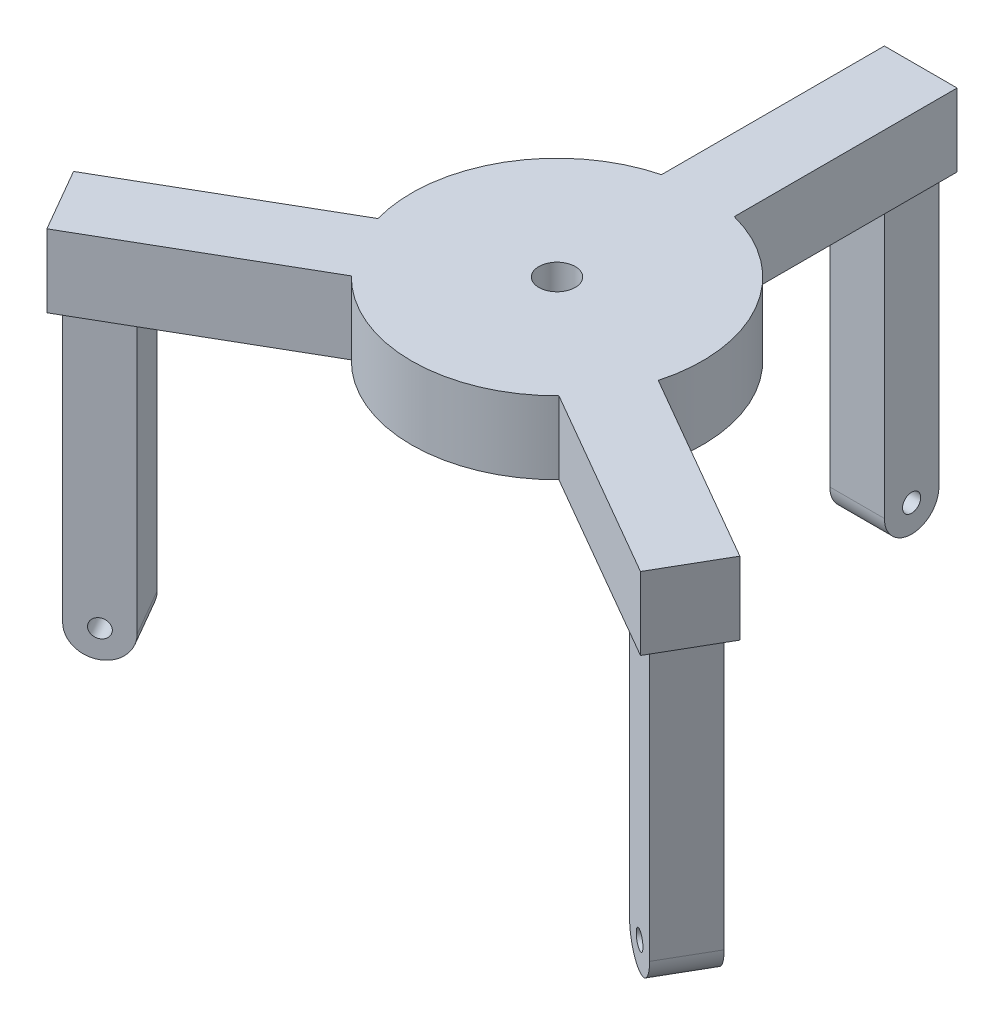
ISO-10303-21;
HEADER;
FILE_DESCRIPTION(('STEP AP214'),'2;1');
FILE_NAME('part.step','',(''),(''),'','','');
FILE_SCHEMA(('AUTOMOTIVE_DESIGN { 1 0 10303 214 1 1 1 1 }'));
ENDSEC;
DATA;
#1=APPLICATION_CONTEXT('core data for automotive mechanical design processes');
#2=APPLICATION_PROTOCOL_DEFINITION('international standard','automotive_design',2000,#1);
#3=PRODUCT_CONTEXT('',#1,'mechanical');
#4=PRODUCT('Part','Part','',(#3));
#5=PRODUCT_RELATED_PRODUCT_CATEGORY('part','',(#4));
#6=PRODUCT_DEFINITION_FORMATION('','',#4);
#7=PRODUCT_DEFINITION_CONTEXT('part definition',#1,'design');
#8=PRODUCT_DEFINITION('design','',#6,#7);
#9=PRODUCT_DEFINITION_SHAPE('','',#8);
#10=(LENGTH_UNIT() NAMED_UNIT(*) SI_UNIT(.MILLI.,.METRE.));
#11=(NAMED_UNIT(*) PLANE_ANGLE_UNIT() SI_UNIT($,.RADIAN.));
#12=(NAMED_UNIT(*) SI_UNIT($,.STERADIAN.) SOLID_ANGLE_UNIT());
#13=UNCERTAINTY_MEASURE_WITH_UNIT(LENGTH_MEASURE(1.E-05),#10,'distance_accuracy_value','');
#14=(GEOMETRIC_REPRESENTATION_CONTEXT(3) GLOBAL_UNCERTAINTY_ASSIGNED_CONTEXT((#13)) GLOBAL_UNIT_ASSIGNED_CONTEXT((#10,
#11,#12)) REPRESENTATION_CONTEXT('',''));
#15=CARTESIAN_POINT('',(0.,0.,0.));
#16=DIRECTION('',(0.,0.,1.));
#17=DIRECTION('',(1.,0.,0.));
#18=AXIS2_PLACEMENT_3D('',#15,#16,#17);
#19=CARTESIAN_POINT('',(0.,0.,0.));
#20=DIRECTION('',(0.,1.,0.));
#21=DIRECTION('',(0.,0.,1.));
#22=AXIS2_PLACEMENT_3D('',#19,#20,#21);
#23=PLANE('',#22);
#24=CARTESIAN_POINT('',(0.,0.,0.));
#25=DIRECTION('',(0.,1.,0.));
#26=DIRECTION('',(0.,0.,1.));
#27=AXIS2_PLACEMENT_3D('',#24,#25,#26);
#28=CIRCLE('',#27,10.);
#29=CARTESIAN_POINT('',(0.,0.,10.));
#30=VERTEX_POINT('',#29);
#31=EDGE_CURVE('E221',#30,#30,#28,.T.);
#32=ORIENTED_EDGE('',*,*,#31,.T.);
#33=EDGE_LOOP('',(#32));
#34=FACE_BOUND('',#33,.T.);
#35=DIRECTION('',(0.866025403784436,0.,0.500000000000004));
#36=VECTOR('',#35,1.);
#37=CARTESIAN_POINT('',(176.374953737965,0.,84.5096189432343));
#38=LINE('',#37,#36);
#39=CARTESIAN_POINT('',(150.394191624432,0.,69.5096189432342));
#40=VERTEX_POINT('',#39);
#41=CARTESIAN_POINT('',(176.374953737965,0.,84.5096189432343));
#42=VERTEX_POINT('',#41);
#43=EDGE_CURVE('E246',#40,#42,#38,.T.);
#44=ORIENTED_EDGE('',*,*,#43,.F.);
#45=DIRECTION('',(0.500000000000004,0.,-0.866025403784436));
#46=VECTOR('',#45,1.);
#47=CARTESIAN_POINT('',(135.394191624432,0.,95.4903810567672));
#48=LINE('',#47,#46);
#49=CARTESIAN_POINT('',(135.394191624432,0.,95.4903810567672));
#50=VERTEX_POINT('',#49);
#51=EDGE_CURVE('E251',#50,#40,#48,.T.);
#52=ORIENTED_EDGE('',*,*,#51,.F.);
#53=DIRECTION('',(-0.866025403784436,0.,-0.500000000000004));
#54=VECTOR('',#53,1.);
#55=CARTESIAN_POINT('',(161.374953737965,0.,110.490381056767));
#56=LINE('',#55,#54);
#57=CARTESIAN_POINT('',(161.374953737965,0.,110.490381056767));
#58=VERTEX_POINT('',#57);
#59=EDGE_CURVE('E260',#58,#50,#56,.T.);
#60=ORIENTED_EDGE('',*,*,#59,.F.);
#61=DIRECTION('',(-0.500000000000004,0.,0.866025403784436));
#62=VECTOR('',#61,1.);
#63=CARTESIAN_POINT('',(161.374953737965,0.,110.490381056767));
#64=LINE('',#63,#62);
#65=EDGE_CURVE('E257',#42,#58,#64,.T.);
#66=ORIENTED_EDGE('',*,*,#65,.F.);
#67=EDGE_LOOP('',(#44,#52,#60,#66));
#68=FACE_BOUND('',#67,.T.);
#69=CARTESIAN_POINT('',(0.,0.,0.));
#70=DIRECTION('',(0.,1.,0.));
#71=DIRECTION('',(0.,0.,1.));
#72=AXIS2_PLACEMENT_3D('',#69,#70,#71);
#73=CIRCLE('',#72,80.);
#74=CARTESIAN_POINT('',(-57.0820393249942,0.,56.0503415377624));
#75=VERTEX_POINT('',#74);
#76=CARTESIAN_POINT('',(57.0820393249934,0.,56.0503415377632));
#77=VERTEX_POINT('',#76);
#78=EDGE_CURVE('E318',#75,#77,#73,.T.);
#79=ORIENTED_EDGE('',*,*,#78,.F.);
#80=DIRECTION('',(0.866025403784443,0.,-0.499999999999992));
#81=VECTOR('',#80,1.);
#82=CARTESIAN_POINT('',(9.99999999999983,0.,17.3205080756888));
#83=LINE('',#82,#81);
#84=CARTESIAN_POINT('',(-163.205080756889,0.,117.320508075687));
#85=VERTEX_POINT('',#84);
#86=EDGE_CURVE('E322',#85,#75,#83,.T.);
#87=ORIENTED_EDGE('',*,*,#86,.F.);
#88=DIRECTION('',(0.499999999999992,0.,0.866025403784443));
#89=VECTOR('',#88,1.);
#90=CARTESIAN_POINT('',(-173.205080756889,0.,99.9999999999984));
#91=LINE('',#90,#89);
#92=CARTESIAN_POINT('',(-183.205080756889,0.,82.6794919243095));
#93=VERTEX_POINT('',#92);
#94=EDGE_CURVE('E367',#93,#85,#91,.T.);
#95=ORIENTED_EDGE('',*,*,#94,.F.);
#96=DIRECTION('',(0.866025403784443,0.,-0.499999999999992));
#97=VECTOR('',#96,1.);
#98=CARTESIAN_POINT('',(-9.99999999999983,0.,-17.3205080756889));
#99=LINE('',#98,#97);
#100=CARTESIAN_POINT('',(-77.0820393249939,0.,21.4093253863847));
#101=VERTEX_POINT('',#100);
#102=EDGE_CURVE('E364',#93,#101,#99,.T.);
#103=ORIENTED_EDGE('',*,*,#102,.T.);
#104=CARTESIAN_POINT('',(-20.,0.,-77.4596669241483));
#105=VERTEX_POINT('',#104);
#106=EDGE_CURVE('E349',#105,#101,#73,.T.);
#107=ORIENTED_EDGE('',*,*,#106,.F.);
#108=DIRECTION('',(0.,0.,1.));
#109=VECTOR('',#108,1.);
#110=CARTESIAN_POINT('',(-20.,0.,0.));
#111=LINE('',#110,#109);
#112=CARTESIAN_POINT('',(-20.,0.,-200.));
#113=VERTEX_POINT('',#112);
#114=EDGE_CURVE('E362',#113,#105,#111,.T.);
#115=ORIENTED_EDGE('',*,*,#114,.F.);
#116=DIRECTION('',(-1.,0.,0.));
#117=VECTOR('',#116,1.);
#118=CARTESIAN_POINT('',(0.,0.,-200.));
#119=LINE('',#118,#117);
#120=CARTESIAN_POINT('',(20.,0.,-200.));
#121=VERTEX_POINT('',#120);
#122=EDGE_CURVE('E360',#121,#113,#119,.T.);
#123=ORIENTED_EDGE('',*,*,#122,.F.);
#124=DIRECTION('',(0.,0.,1.));
#125=VECTOR('',#124,1.);
#126=CARTESIAN_POINT('',(20.,0.,0.));
#127=LINE('',#126,#125);
#128=CARTESIAN_POINT('',(20.,0.,-77.4596669241483));
#129=VERTEX_POINT('',#128);
#130=EDGE_CURVE('E357',#121,#129,#127,.T.);
#131=ORIENTED_EDGE('',*,*,#130,.T.);
#132=CARTESIAN_POINT('',(77.0820393249936,0.,21.4093253863857));
#133=VERTEX_POINT('',#132);
#134=EDGE_CURVE('E350',#133,#129,#73,.T.);
#135=ORIENTED_EDGE('',*,*,#134,.F.);
#136=DIRECTION('',(-0.866025403784436,0.,-0.500000000000004));
#137=VECTOR('',#136,1.);
#138=CARTESIAN_POINT('',(10.0000000000001,0.,-17.3205080756887));
#139=LINE('',#138,#137);
#140=CARTESIAN_POINT('',(183.205080756887,0.,82.6794919243121));
#141=VERTEX_POINT('',#140);
#142=EDGE_CURVE('E355',#141,#133,#139,.T.);
#143=ORIENTED_EDGE('',*,*,#142,.F.);
#144=DIRECTION('',(0.500000000000004,0.,-0.866025403784436));
#145=VECTOR('',#144,1.);
#146=CARTESIAN_POINT('',(173.205080756887,0.,100.000000000001));
#147=LINE('',#146,#145);
#148=CARTESIAN_POINT('',(163.205080756887,0.,117.32050807569));
#149=VERTEX_POINT('',#148);
#150=EDGE_CURVE('E353',#149,#141,#147,.T.);
#151=ORIENTED_EDGE('',*,*,#150,.F.);
#152=DIRECTION('',(-0.866025403784436,0.,-0.500000000000004));
#153=VECTOR('',#152,1.);
#154=CARTESIAN_POINT('',(-10.0000000000001,0.,17.3205080756887));
#155=LINE('',#154,#153);
#156=EDGE_CURVE('E348',#149,#77,#155,.T.);
#157=ORIENTED_EDGE('',*,*,#156,.T.);
#158=EDGE_LOOP('',(#79,#87,#95,#103,#107,#115,#123,#131,#135,#143,#151,#157));
#159=FACE_BOUND('',#158,.T.);
#160=DIRECTION('',(0.,0.,-1.));
#161=VECTOR('',#160,1.);
#162=CARTESIAN_POINT('',(-15.,0.,-195.));
#163=LINE('',#162,#161);
#164=CARTESIAN_POINT('',(-15.,0.,-165.));
#165=VERTEX_POINT('',#164);
#166=CARTESIAN_POINT('',(-15.,0.,-195.));
#167=VERTEX_POINT('',#166);
#168=EDGE_CURVE('E286',#165,#167,#163,.T.);
#169=ORIENTED_EDGE('',*,*,#168,.F.);
#170=DIRECTION('',(-1.,0.,0.));
#171=VECTOR('',#170,1.);
#172=CARTESIAN_POINT('',(15.,0.,-165.));
#173=LINE('',#172,#171);
#174=CARTESIAN_POINT('',(15.,0.,-165.));
#175=VERTEX_POINT('',#174);
#176=EDGE_CURVE('E293',#175,#165,#173,.T.);
#177=ORIENTED_EDGE('',*,*,#176,.F.);
#178=DIRECTION('',(0.,0.,1.));
#179=VECTOR('',#178,1.);
#180=CARTESIAN_POINT('',(15.,0.,-195.));
#181=LINE('',#180,#179);
#182=CARTESIAN_POINT('',(15.,0.,-195.));
#183=VERTEX_POINT('',#182);
#184=EDGE_CURVE('E302',#183,#175,#181,.T.);
#185=ORIENTED_EDGE('',*,*,#184,.F.);
#186=DIRECTION('',(1.,0.,0.));
#187=VECTOR('',#186,1.);
#188=CARTESIAN_POINT('',(15.,0.,-195.));
#189=LINE('',#188,#187);
#190=EDGE_CURVE('E299',#167,#183,#189,.T.);
#191=ORIENTED_EDGE('',*,*,#190,.F.);
#192=EDGE_LOOP('',(#169,#177,#185,#191));
#193=FACE_BOUND('',#192,.T.);
#194=DIRECTION('',(-0.866025403784443,0.,0.499999999999992));
#195=VECTOR('',#194,1.);
#196=CARTESIAN_POINT('',(-161.374953737967,0.,110.490381056765));
#197=LINE('',#196,#195);
#198=CARTESIAN_POINT('',(-135.394191624433,0.,95.4903810567653));
#199=VERTEX_POINT('',#198);
#200=CARTESIAN_POINT('',(-161.374953737967,0.,110.490381056765));
#201=VERTEX_POINT('',#200);
#202=EDGE_CURVE('E232',#199,#201,#197,.T.);
#203=ORIENTED_EDGE('',*,*,#202,.F.);
#204=DIRECTION('',(0.499999999999992,0.,0.866025403784443));
#205=VECTOR('',#204,1.);
#206=CARTESIAN_POINT('',(-150.394191624433,0.,69.509618943232));
#207=LINE('',#206,#205);
#208=CARTESIAN_POINT('',(-150.394191624433,0.,69.509618943232));
#209=VERTEX_POINT('',#208);
#210=EDGE_CURVE('E235',#209,#199,#207,.T.);
#211=ORIENTED_EDGE('',*,*,#210,.F.);
#212=DIRECTION('',(0.866025403784443,0.,-0.499999999999992));
#213=VECTOR('',#212,1.);
#214=CARTESIAN_POINT('',(-176.374953737966,0.,84.5096189432318));
#215=LINE('',#214,#213);
#216=CARTESIAN_POINT('',(-176.374953737966,0.,84.5096189432318));
#217=VERTEX_POINT('',#216);
#218=EDGE_CURVE('E60',#217,#209,#215,.T.);
#219=ORIENTED_EDGE('',*,*,#218,.F.);
#220=DIRECTION('',(-0.499999999999992,0.,-0.866025403784443));
#221=VECTOR('',#220,1.);
#222=CARTESIAN_POINT('',(-176.374953737966,0.,84.5096189432318));
#223=LINE('',#222,#221);
#224=EDGE_CURVE('E55',#201,#217,#223,.T.);
#225=ORIENTED_EDGE('',*,*,#224,.F.);
#226=EDGE_LOOP('',(#203,#211,#219,#225));
#227=FACE_BOUND('',#226,.T.);
#228=ADVANCED_FACE('F40',(#34,#68,#159,#193,#227),#23,.F.);
#229=CARTESIAN_POINT('',(0.,40.,0.));
#230=DIRECTION('',(0.,-1.,0.));
#231=DIRECTION('',(0.,0.,-1.));
#232=AXIS2_PLACEMENT_3D('',#229,#230,#231);
#233=CYLINDRICAL_SURFACE('',#232,80.);
#234=ORIENTED_EDGE('',*,*,#78,.T.);
#235=DIRECTION('',(0.,-1.,0.));
#236=VECTOR('',#235,1.);
#237=CARTESIAN_POINT('',(57.0820393249934,40.,56.0503415377632));
#238=LINE('',#237,#236);
#239=CARTESIAN_POINT('',(57.0820393249934,40.,56.0503415377632));
#240=VERTEX_POINT('',#239);
#241=EDGE_CURVE('E11',#240,#77,#238,.T.);
#242=ORIENTED_EDGE('',*,*,#241,.F.);
#243=CARTESIAN_POINT('',(0.,40.,0.));
#244=DIRECTION('',(0.,1.,0.));
#245=DIRECTION('',(0.,0.,1.));
#246=AXIS2_PLACEMENT_3D('',#243,#244,#245);
#247=CIRCLE('',#246,80.);
#248=CARTESIAN_POINT('',(-57.0820393249942,40.,56.0503415377624));
#249=VERTEX_POINT('',#248);
#250=EDGE_CURVE('E319',#249,#240,#247,.T.);
#251=ORIENTED_EDGE('',*,*,#250,.F.);
#252=DIRECTION('',(0.,-1.,0.));
#253=VECTOR('',#252,1.);
#254=CARTESIAN_POINT('',(-57.0820393249942,40.,56.0503415377624));
#255=LINE('',#254,#253);
#256=EDGE_CURVE('E345',#249,#75,#255,.T.);
#257=ORIENTED_EDGE('',*,*,#256,.T.);
#258=EDGE_LOOP('',(#234,#242,#251,#257));
#259=FACE_BOUND('',#258,.T.);
#260=ADVANCED_FACE('F410',(#259),#233,.T.);
#261=CARTESIAN_POINT('',(-10.0000000000001,40.,17.3205080756887));
#262=DIRECTION('',(-0.500000000000004,0.,0.866025403784436));
#263=DIRECTION('',(0.866025403784436,0.,0.500000000000004));
#264=AXIS2_PLACEMENT_3D('',#261,#262,#263);
#265=PLANE('',#264);
#266=ORIENTED_EDGE('',*,*,#156,.F.);
#267=DIRECTION('',(0.,-1.,0.));
#268=VECTOR('',#267,1.);
#269=CARTESIAN_POINT('',(163.205080756887,40.,117.32050807569));
#270=LINE('',#269,#268);
#271=CARTESIAN_POINT('',(163.205080756887,40.,117.32050807569));
#272=VERTEX_POINT('',#271);
#273=EDGE_CURVE('E48',#272,#149,#270,.T.);
#274=ORIENTED_EDGE('',*,*,#273,.F.);
#275=DIRECTION('',(-0.866025403784436,0.,-0.500000000000004));
#276=VECTOR('',#275,1.);
#277=CARTESIAN_POINT('',(-10.0000000000001,40.,17.3205080756887));
#278=LINE('',#277,#276);
#279=EDGE_CURVE('E321',#272,#240,#278,.T.);
#280=ORIENTED_EDGE('',*,*,#279,.T.);
#281=ORIENTED_EDGE('',*,*,#241,.T.);
#282=EDGE_LOOP('',(#266,#274,#280,#281));
#283=FACE_BOUND('',#282,.T.);
#284=ADVANCED_FACE('F42',(#283),#265,.T.);
#285=CARTESIAN_POINT('',(173.205080756887,40.,100.000000000001));
#286=DIRECTION('',(-0.866025403784436,0.,-0.500000000000004));
#287=DIRECTION('',(-0.500000000000004,0.,0.866025403784436));
#288=AXIS2_PLACEMENT_3D('',#285,#286,#287);
#289=PLANE('',#288);
#290=ORIENTED_EDGE('',*,*,#150,.T.);
#291=DIRECTION('',(0.,-1.,0.));
#292=VECTOR('',#291,1.);
#293=CARTESIAN_POINT('',(183.205080756887,40.,82.6794919243121));
#294=LINE('',#293,#292);
#295=CARTESIAN_POINT('',(183.205080756887,40.,82.6794919243121));
#296=VERTEX_POINT('',#295);
#297=EDGE_CURVE('E392',#296,#141,#294,.T.);
#298=ORIENTED_EDGE('',*,*,#297,.F.);
#299=DIRECTION('',(0.500000000000004,0.,-0.866025403784436));
#300=VECTOR('',#299,1.);
#301=CARTESIAN_POINT('',(173.205080756887,40.,100.000000000001));
#302=LINE('',#301,#300);
#303=EDGE_CURVE('E327',#272,#296,#302,.T.);
#304=ORIENTED_EDGE('',*,*,#303,.F.);
#305=ORIENTED_EDGE('',*,*,#273,.T.);
#306=EDGE_LOOP('',(#290,#298,#304,#305));
#307=FACE_BOUND('',#306,.T.);
#308=ADVANCED_FACE('F397',(#307),#289,.F.);
#309=CARTESIAN_POINT('',(10.0000000000001,40.,-17.3205080756887));
#310=DIRECTION('',(-0.500000000000004,0.,0.866025403784437));
#311=DIRECTION('',(0.866025403784437,0.,0.500000000000004));
#312=AXIS2_PLACEMENT_3D('',#309,#310,#311);
#313=PLANE('',#312);
#314=ORIENTED_EDGE('',*,*,#142,.T.);
#315=DIRECTION('',(0.,-1.,0.));
#316=VECTOR('',#315,1.);
#317=CARTESIAN_POINT('',(77.0820393249936,40.,21.4093253863857));
#318=LINE('',#317,#316);
#319=CARTESIAN_POINT('',(77.0820393249936,40.,21.4093253863857));
#320=VERTEX_POINT('',#319);
#321=EDGE_CURVE('E389',#320,#133,#318,.T.);
#322=ORIENTED_EDGE('',*,*,#321,.F.);
#323=DIRECTION('',(-0.866025403784436,0.,-0.500000000000004));
#324=VECTOR('',#323,1.);
#325=CARTESIAN_POINT('',(10.0000000000001,40.,-17.3205080756887));
#326=LINE('',#325,#324);
#327=EDGE_CURVE('E329',#296,#320,#326,.T.);
#328=ORIENTED_EDGE('',*,*,#327,.F.);
#329=ORIENTED_EDGE('',*,*,#297,.T.);
#330=EDGE_LOOP('',(#314,#322,#328,#329));
#331=FACE_BOUND('',#330,.T.);
#332=ADVANCED_FACE('F463',(#331),#313,.F.);
#333=ORIENTED_EDGE('',*,*,#134,.T.);
#334=DIRECTION('',(0.,-1.,0.));
#335=VECTOR('',#334,1.);
#336=CARTESIAN_POINT('',(20.,40.,-77.4596669241483));
#337=LINE('',#336,#335);
#338=CARTESIAN_POINT('',(20.,40.,-77.4596669241483));
#339=VERTEX_POINT('',#338);
#340=EDGE_CURVE('E387',#339,#129,#337,.T.);
#341=ORIENTED_EDGE('',*,*,#340,.F.);
#342=EDGE_CURVE('E324',#320,#339,#247,.T.);
#343=ORIENTED_EDGE('',*,*,#342,.F.);
#344=ORIENTED_EDGE('',*,*,#321,.T.);
#345=EDGE_LOOP('',(#333,#341,#343,#344));
#346=FACE_BOUND('',#345,.T.);
#347=ADVANCED_FACE('F434',(#346),#233,.T.);
#348=CARTESIAN_POINT('',(20.,40.,0.));
#349=DIRECTION('',(1.,0.,0.));
#350=DIRECTION('',(0.,0.,-1.));
#351=AXIS2_PLACEMENT_3D('',#348,#349,#350);
#352=PLANE('',#351);
#353=ORIENTED_EDGE('',*,*,#130,.F.);
#354=DIRECTION('',(0.,-1.,0.));
#355=VECTOR('',#354,1.);
#356=CARTESIAN_POINT('',(20.,40.,-200.));
#357=LINE('',#356,#355);
#358=CARTESIAN_POINT('',(20.,40.,-200.));
#359=VERTEX_POINT('',#358);
#360=EDGE_CURVE('E385',#359,#121,#357,.T.);
#361=ORIENTED_EDGE('',*,*,#360,.F.);
#362=DIRECTION('',(0.,0.,1.));
#363=VECTOR('',#362,1.);
#364=CARTESIAN_POINT('',(20.,40.,0.));
#365=LINE('',#364,#363);
#366=EDGE_CURVE('E331',#359,#339,#365,.T.);
#367=ORIENTED_EDGE('',*,*,#366,.T.);
#368=ORIENTED_EDGE('',*,*,#340,.T.);
#369=EDGE_LOOP('',(#353,#361,#367,#368));
#370=FACE_BOUND('',#369,.T.);
#371=ADVANCED_FACE('F439',(#370),#352,.T.);
#372=CARTESIAN_POINT('',(0.,40.,-200.));
#373=DIRECTION('',(0.,0.,1.));
#374=DIRECTION('',(1.,0.,0.));
#375=AXIS2_PLACEMENT_3D('',#372,#373,#374);
#376=PLANE('',#375);
#377=ORIENTED_EDGE('',*,*,#122,.T.);
#378=DIRECTION('',(0.,-1.,0.));
#379=VECTOR('',#378,1.);
#380=CARTESIAN_POINT('',(-20.,40.,-200.));
#381=LINE('',#380,#379);
#382=CARTESIAN_POINT('',(-20.,40.,-200.));
#383=VERTEX_POINT('',#382);
#384=EDGE_CURVE('E382',#383,#113,#381,.T.);
#385=ORIENTED_EDGE('',*,*,#384,.F.);
#386=DIRECTION('',(-1.,0.,0.));
#387=VECTOR('',#386,1.);
#388=CARTESIAN_POINT('',(0.,40.,-200.));
#389=LINE('',#388,#387);
#390=EDGE_CURVE('E334',#359,#383,#389,.T.);
#391=ORIENTED_EDGE('',*,*,#390,.F.);
#392=ORIENTED_EDGE('',*,*,#360,.T.);
#393=EDGE_LOOP('',(#377,#385,#391,#392));
#394=FACE_BOUND('',#393,.T.);
#395=ADVANCED_FACE('F458',(#394),#376,.F.);
#396=CARTESIAN_POINT('',(-20.,40.,0.));
#397=DIRECTION('',(1.,0.,0.));
#398=DIRECTION('',(0.,0.,-1.));
#399=AXIS2_PLACEMENT_3D('',#396,#397,#398);
#400=PLANE('',#399);
#401=ORIENTED_EDGE('',*,*,#114,.T.);
#402=DIRECTION('',(0.,-1.,0.));
#403=VECTOR('',#402,1.);
#404=CARTESIAN_POINT('',(-20.,40.,-77.4596669241483));
#405=LINE('',#404,#403);
#406=CARTESIAN_POINT('',(-20.,40.,-77.4596669241483));
#407=VERTEX_POINT('',#406);
#408=EDGE_CURVE('E379',#407,#105,#405,.T.);
#409=ORIENTED_EDGE('',*,*,#408,.F.);
#410=DIRECTION('',(0.,0.,1.));
#411=VECTOR('',#410,1.);
#412=CARTESIAN_POINT('',(-20.,40.,0.));
#413=LINE('',#412,#411);
#414=EDGE_CURVE('E336',#383,#407,#413,.T.);
#415=ORIENTED_EDGE('',*,*,#414,.F.);
#416=ORIENTED_EDGE('',*,*,#384,.T.);
#417=EDGE_LOOP('',(#401,#409,#415,#416));
#418=FACE_BOUND('',#417,.T.);
#419=ADVANCED_FACE('F451',(#418),#400,.F.);
#420=ORIENTED_EDGE('',*,*,#106,.T.);
#421=DIRECTION('',(0.,-1.,0.));
#422=VECTOR('',#421,1.);
#423=CARTESIAN_POINT('',(-77.0820393249939,40.,21.4093253863847));
#424=LINE('',#423,#422);
#425=CARTESIAN_POINT('',(-77.0820393249939,40.,21.4093253863847));
#426=VERTEX_POINT('',#425);
#427=EDGE_CURVE('E377',#426,#101,#424,.T.);
#428=ORIENTED_EDGE('',*,*,#427,.F.);
#429=EDGE_CURVE('E323',#407,#426,#247,.T.);
#430=ORIENTED_EDGE('',*,*,#429,.F.);
#431=ORIENTED_EDGE('',*,*,#408,.T.);
#432=EDGE_LOOP('',(#420,#428,#430,#431));
#433=FACE_BOUND('',#432,.T.);
#434=ADVANCED_FACE('F449',(#433),#233,.T.);
#435=CARTESIAN_POINT('',(-9.99999999999983,40.,-17.3205080756889));
#436=DIRECTION('',(-0.499999999999992,0.,-0.866025403784443));
#437=DIRECTION('',(-0.866025403784443,0.,0.499999999999992));
#438=AXIS2_PLACEMENT_3D('',#435,#436,#437);
#439=PLANE('',#438);
#440=ORIENTED_EDGE('',*,*,#102,.F.);
#441=DIRECTION('',(0.,-1.,0.));
#442=VECTOR('',#441,1.);
#443=CARTESIAN_POINT('',(-183.205080756889,40.,82.6794919243095));
#444=LINE('',#443,#442);
#445=CARTESIAN_POINT('',(-183.205080756889,40.,82.6794919243095));
#446=VERTEX_POINT('',#445);
#447=EDGE_CURVE('E375',#446,#93,#444,.T.);
#448=ORIENTED_EDGE('',*,*,#447,.F.);
#449=DIRECTION('',(0.866025403784443,0.,-0.499999999999992));
#450=VECTOR('',#449,1.);
#451=CARTESIAN_POINT('',(-9.99999999999983,40.,-17.3205080756889));
#452=LINE('',#451,#450);
#453=EDGE_CURVE('E338',#446,#426,#452,.T.);
#454=ORIENTED_EDGE('',*,*,#453,.T.);
#455=ORIENTED_EDGE('',*,*,#427,.T.);
#456=EDGE_LOOP('',(#440,#448,#454,#455));
#457=FACE_BOUND('',#456,.T.);
#458=ADVANCED_FACE('F424',(#457),#439,.T.);
#459=CARTESIAN_POINT('',(-173.205080756889,40.,99.9999999999984));
#460=DIRECTION('',(0.866025403784443,0.,-0.499999999999992));
#461=DIRECTION('',(-0.499999999999992,0.,-0.866025403784443));
#462=AXIS2_PLACEMENT_3D('',#459,#460,#461);
#463=PLANE('',#462);
#464=ORIENTED_EDGE('',*,*,#94,.T.);
#465=DIRECTION('',(0.,-1.,0.));
#466=VECTOR('',#465,1.);
#467=CARTESIAN_POINT('',(-163.205080756889,40.,117.320508075687));
#468=LINE('',#467,#466);
#469=CARTESIAN_POINT('',(-163.205080756889,40.,117.320508075687));
#470=VERTEX_POINT('',#469);
#471=EDGE_CURVE('E372',#470,#85,#468,.T.);
#472=ORIENTED_EDGE('',*,*,#471,.F.);
#473=DIRECTION('',(0.499999999999992,0.,0.866025403784443));
#474=VECTOR('',#473,1.);
#475=CARTESIAN_POINT('',(-173.205080756889,40.,99.9999999999984));
#476=LINE('',#475,#474);
#477=EDGE_CURVE('E341',#446,#470,#476,.T.);
#478=ORIENTED_EDGE('',*,*,#477,.F.);
#479=ORIENTED_EDGE('',*,*,#447,.T.);
#480=EDGE_LOOP('',(#464,#472,#478,#479));
#481=FACE_BOUND('',#480,.T.);
#482=ADVANCED_FACE('F421',(#481),#463,.F.);
#483=CARTESIAN_POINT('',(9.99999999999983,40.,17.3205080756888));
#484=DIRECTION('',(-0.499999999999992,0.,-0.866025403784443));
#485=DIRECTION('',(-0.866025403784443,0.,0.499999999999992));
#486=AXIS2_PLACEMENT_3D('',#483,#484,#485);
#487=PLANE('',#486);
#488=ORIENTED_EDGE('',*,*,#86,.T.);
#489=ORIENTED_EDGE('',*,*,#256,.F.);
#490=DIRECTION('',(0.866025403784443,0.,-0.499999999999992));
#491=VECTOR('',#490,1.);
#492=CARTESIAN_POINT('',(9.99999999999983,40.,17.3205080756888));
#493=LINE('',#492,#491);
#494=EDGE_CURVE('E343',#470,#249,#493,.T.);
#495=ORIENTED_EDGE('',*,*,#494,.F.);
#496=ORIENTED_EDGE('',*,*,#471,.T.);
#497=EDGE_LOOP('',(#488,#489,#495,#496));
#498=FACE_BOUND('',#497,.T.);
#499=ADVANCED_FACE('F416',(#498),#487,.F.);
#500=CARTESIAN_POINT('',(0.,40.,0.));
#501=DIRECTION('',(0.,1.,0.));
#502=DIRECTION('',(0.,0.,1.));
#503=AXIS2_PLACEMENT_3D('',#500,#501,#502);
#504=PLANE('',#503);
#505=CARTESIAN_POINT('',(0.,40.,0.));
#506=DIRECTION('',(0.,1.,0.));
#507=DIRECTION('',(0.,0.,1.));
#508=AXIS2_PLACEMENT_3D('',#505,#506,#507);
#509=CIRCLE('',#508,10.);
#510=CARTESIAN_POINT('',(0.,40.,10.));
#511=VERTEX_POINT('',#510);
#512=EDGE_CURVE('E226',#511,#511,#509,.T.);
#513=ORIENTED_EDGE('',*,*,#512,.F.);
#514=EDGE_LOOP('',(#513));
#515=FACE_BOUND('',#514,.T.);
#516=ORIENTED_EDGE('',*,*,#250,.T.);
#517=ORIENTED_EDGE('',*,*,#279,.F.);
#518=ORIENTED_EDGE('',*,*,#303,.T.);
#519=ORIENTED_EDGE('',*,*,#327,.T.);
#520=ORIENTED_EDGE('',*,*,#342,.T.);
#521=ORIENTED_EDGE('',*,*,#366,.F.);
#522=ORIENTED_EDGE('',*,*,#390,.T.);
#523=ORIENTED_EDGE('',*,*,#414,.T.);
#524=ORIENTED_EDGE('',*,*,#429,.T.);
#525=ORIENTED_EDGE('',*,*,#453,.F.);
#526=ORIENTED_EDGE('',*,*,#477,.T.);
#527=ORIENTED_EDGE('',*,*,#494,.T.);
#528=EDGE_LOOP('',(#516,#517,#518,#519,#520,#521,#522,#523,#524,#525,#526,#527));
#529=FACE_BOUND('',#528,.T.);
#530=ADVANCED_FACE('F443',(#515,#529),#504,.T.);
#531=CARTESIAN_POINT('',(-15.,-150.,-195.));
#532=DIRECTION('',(1.,0.,0.));
#533=DIRECTION('',(0.,0.,-1.));
#534=AXIS2_PLACEMENT_3D('',#531,#532,#533);
#535=PLANE('',#534);
#536=CARTESIAN_POINT('',(-15.,-150.,-180.));
#537=DIRECTION('',(1.,0.,0.));
#538=DIRECTION('',(0.,0.,-1.));
#539=AXIS2_PLACEMENT_3D('',#536,#537,#538);
#540=CIRCLE('',#539,4.99999999999999);
#541=CARTESIAN_POINT('',(-15.,-150.,-185.));
#542=VERTEX_POINT('',#541);
#543=EDGE_CURVE('E277',#542,#542,#540,.T.);
#544=ORIENTED_EDGE('',*,*,#543,.T.);
#545=EDGE_LOOP('',(#544));
#546=FACE_BOUND('',#545,.T.);
#547=ORIENTED_EDGE('',*,*,#168,.T.);
#548=DIRECTION('',(0.,1.,0.));
#549=VECTOR('',#548,1.);
#550=CARTESIAN_POINT('',(-15.,-150.,-195.));
#551=LINE('',#550,#549);
#552=CARTESIAN_POINT('',(-15.,-150.,-195.));
#553=VERTEX_POINT('',#552);
#554=EDGE_CURVE('E315',#553,#167,#551,.T.);
#555=ORIENTED_EDGE('',*,*,#554,.F.);
#556=CARTESIAN_POINT('',(-15.,-150.,-180.));
#557=DIRECTION('',(1.,0.,0.));
#558=DIRECTION('',(0.,0.,-1.));
#559=AXIS2_PLACEMENT_3D('',#556,#557,#558);
#560=CIRCLE('',#559,15.);
#561=CARTESIAN_POINT('',(-15.,-150.,-165.));
#562=VERTEX_POINT('',#561);
#563=EDGE_CURVE('E283',#562,#553,#560,.T.);
#564=ORIENTED_EDGE('',*,*,#563,.F.);
#565=DIRECTION('',(0.,1.,0.));
#566=VECTOR('',#565,1.);
#567=CARTESIAN_POINT('',(-15.,-150.,-165.));
#568=LINE('',#567,#566);
#569=EDGE_CURVE('E296',#562,#165,#568,.T.);
#570=ORIENTED_EDGE('',*,*,#569,.T.);
#571=EDGE_LOOP('',(#547,#555,#564,#570));
#572=FACE_BOUND('',#571,.T.);
#573=ADVANCED_FACE('F491',(#546,#572),#535,.F.);
#574=CARTESIAN_POINT('',(15.,-150.,-195.));
#575=DIRECTION('',(0.,0.,1.));
#576=DIRECTION('',(1.,0.,0.));
#577=AXIS2_PLACEMENT_3D('',#574,#575,#576);
#578=PLANE('',#577);
#579=ORIENTED_EDGE('',*,*,#190,.T.);
#580=DIRECTION('',(0.,1.,0.));
#581=VECTOR('',#580,1.);
#582=CARTESIAN_POINT('',(15.,-150.,-195.));
#583=LINE('',#582,#581);
#584=CARTESIAN_POINT('',(15.,-150.,-195.));
#585=VERTEX_POINT('',#584);
#586=EDGE_CURVE('E312',#585,#183,#583,.T.);
#587=ORIENTED_EDGE('',*,*,#586,.F.);
#588=DIRECTION('',(1.,0.,0.));
#589=VECTOR('',#588,1.);
#590=CARTESIAN_POINT('',(15.,-150.,-195.));
#591=LINE('',#590,#589);
#592=EDGE_CURVE('E289',#553,#585,#591,.T.);
#593=ORIENTED_EDGE('',*,*,#592,.F.);
#594=ORIENTED_EDGE('',*,*,#554,.T.);
#595=EDGE_LOOP('',(#579,#587,#593,#594));
#596=FACE_BOUND('',#595,.T.);
#597=ADVANCED_FACE('F499',(#596),#578,.F.);
#598=CARTESIAN_POINT('',(15.,-150.,-195.));
#599=DIRECTION('',(-1.,0.,0.));
#600=DIRECTION('',(0.,0.,1.));
#601=AXIS2_PLACEMENT_3D('',#598,#599,#600);
#602=PLANE('',#601);
#603=CARTESIAN_POINT('',(15.,-150.,-180.));
#604=DIRECTION('',(1.,0.,0.));
#605=DIRECTION('',(0.,0.,-1.));
#606=AXIS2_PLACEMENT_3D('',#603,#604,#605);
#607=CIRCLE('',#606,4.99999999999999);
#608=CARTESIAN_POINT('',(15.,-150.,-185.));
#609=VERTEX_POINT('',#608);
#610=EDGE_CURVE('E276',#609,#609,#607,.T.);
#611=ORIENTED_EDGE('',*,*,#610,.F.);
#612=EDGE_LOOP('',(#611));
#613=FACE_BOUND('',#612,.T.);
#614=ORIENTED_EDGE('',*,*,#184,.T.);
#615=DIRECTION('',(0.,1.,0.));
#616=VECTOR('',#615,1.);
#617=CARTESIAN_POINT('',(15.,-150.,-165.));
#618=LINE('',#617,#616);
#619=CARTESIAN_POINT('',(15.,-150.,-165.));
#620=VERTEX_POINT('',#619);
#621=EDGE_CURVE('E309',#620,#175,#618,.T.);
#622=ORIENTED_EDGE('',*,*,#621,.F.);
#623=CARTESIAN_POINT('',(15.,-150.,-180.));
#624=DIRECTION('',(1.,0.,0.));
#625=DIRECTION('',(0.,0.,-1.));
#626=AXIS2_PLACEMENT_3D('',#623,#624,#625);
#627=CIRCLE('',#626,15.);
#628=EDGE_CURVE('E280',#620,#585,#627,.T.);
#629=ORIENTED_EDGE('',*,*,#628,.T.);
#630=ORIENTED_EDGE('',*,*,#586,.T.);
#631=EDGE_LOOP('',(#614,#622,#629,#630));
#632=FACE_BOUND('',#631,.T.);
#633=ADVANCED_FACE('F507',(#613,#632),#602,.F.);
#634=CARTESIAN_POINT('',(15.,-150.,-165.));
#635=DIRECTION('',(0.,0.,-1.));
#636=DIRECTION('',(-1.,0.,0.));
#637=AXIS2_PLACEMENT_3D('',#634,#635,#636);
#638=PLANE('',#637);
#639=ORIENTED_EDGE('',*,*,#176,.T.);
#640=ORIENTED_EDGE('',*,*,#569,.F.);
#641=DIRECTION('',(-1.,0.,0.));
#642=VECTOR('',#641,1.);
#643=CARTESIAN_POINT('',(15.,-150.,-165.));
#644=LINE('',#643,#642);
#645=EDGE_CURVE('E292',#620,#562,#644,.T.);
#646=ORIENTED_EDGE('',*,*,#645,.F.);
#647=ORIENTED_EDGE('',*,*,#621,.T.);
#648=EDGE_LOOP('',(#639,#640,#646,#647));
#649=FACE_BOUND('',#648,.T.);
#650=ADVANCED_FACE('F515',(#649),#638,.F.);
#651=CARTESIAN_POINT('',(-15.,-150.,-180.));
#652=DIRECTION('',(1.,0.,0.));
#653=DIRECTION('',(0.,0.,-1.));
#654=AXIS2_PLACEMENT_3D('',#651,#652,#653);
#655=CYLINDRICAL_SURFACE('',#654,15.);
#656=ORIENTED_EDGE('',*,*,#628,.F.);
#657=ORIENTED_EDGE('',*,*,#645,.T.);
#658=ORIENTED_EDGE('',*,*,#563,.T.);
#659=ORIENTED_EDGE('',*,*,#592,.T.);
#660=EDGE_LOOP('',(#656,#657,#658,#659));
#661=FACE_BOUND('',#660,.T.);
#662=ADVANCED_FACE('F523',(#661),#655,.T.);
#663=CARTESIAN_POINT('',(-15.,-150.,-180.));
#664=DIRECTION('',(1.,0.,0.));
#665=DIRECTION('',(0.,0.,-1.));
#666=AXIS2_PLACEMENT_3D('',#663,#664,#665);
#667=CYLINDRICAL_SURFACE('',#666,4.99999999999999);
#668=ORIENTED_EDGE('',*,*,#543,.F.);
#669=EDGE_LOOP('',(#668));
#670=FACE_BOUND('',#669,.T.);
#671=ORIENTED_EDGE('',*,*,#610,.T.);
#672=EDGE_LOOP('',(#671));
#673=FACE_BOUND('',#672,.T.);
#674=ADVANCED_FACE('F530',(#670,#673),#667,.F.);
#675=CARTESIAN_POINT('',(176.374953737965,-150.,84.5096189432343));
#676=DIRECTION('',(-0.500000000000004,0.,0.866025403784436));
#677=DIRECTION('',(0.866025403784436,0.,0.500000000000004));
#678=AXIS2_PLACEMENT_3D('',#675,#676,#677);
#679=PLANE('',#678);
#680=CARTESIAN_POINT('',(163.384572681199,-150.,77.0096189432342));
#681=DIRECTION('',(-0.500000000000004,0.,0.866025403784436));
#682=DIRECTION('',(0.866025403784436,0.,0.500000000000004));
#683=AXIS2_PLACEMENT_3D('',#680,#681,#682);
#684=CIRCLE('',#683,5.);
#685=CARTESIAN_POINT('',(167.714699700121,-150.,79.5096189432343));
#686=VERTEX_POINT('',#685);
#687=EDGE_CURVE('E791',#686,#686,#684,.T.);
#688=ORIENTED_EDGE('',*,*,#687,.T.);
#689=EDGE_LOOP('',(#688));
#690=FACE_BOUND('',#689,.T.);
#691=ORIENTED_EDGE('',*,*,#43,.T.);
#692=DIRECTION('',(0.,1.,0.));
#693=VECTOR('',#692,1.);
#694=CARTESIAN_POINT('',(176.374953737965,-150.,84.5096189432343));
#695=LINE('',#694,#693);
#696=CARTESIAN_POINT('',(176.374953737965,-150.,84.5096189432343));
#697=VERTEX_POINT('',#696);
#698=EDGE_CURVE('E273',#697,#42,#695,.T.);
#699=ORIENTED_EDGE('',*,*,#698,.F.);
#700=CARTESIAN_POINT('',(163.384572681199,-150.,77.0096189432342));
#701=DIRECTION('',(-0.500000000000004,0.,0.866025403784436));
#702=DIRECTION('',(0.866025403784436,0.,0.500000000000004));
#703=AXIS2_PLACEMENT_3D('',#700,#701,#702);
#704=CIRCLE('',#703,15.);
#705=CARTESIAN_POINT('',(150.394191624432,-150.,69.5096189432342));
#706=VERTEX_POINT('',#705);
#707=EDGE_CURVE('E229',#706,#697,#704,.T.);
#708=ORIENTED_EDGE('',*,*,#707,.F.);
#709=DIRECTION('',(0.,1.,0.));
#710=VECTOR('',#709,1.);
#711=CARTESIAN_POINT('',(150.394191624432,-150.,69.5096189432342));
#712=LINE('',#711,#710);
#713=EDGE_CURVE('E254',#706,#40,#712,.T.);
#714=ORIENTED_EDGE('',*,*,#713,.T.);
#715=EDGE_LOOP('',(#691,#699,#708,#714));
#716=FACE_BOUND('',#715,.T.);
#717=ADVANCED_FACE('F537',(#690,#716),#679,.F.);
#718=CARTESIAN_POINT('',(161.374953737965,-150.,110.490381056767));
#719=DIRECTION('',(-0.866025403784436,0.,-0.500000000000004));
#720=DIRECTION('',(-0.500000000000004,0.,0.866025403784436));
#721=AXIS2_PLACEMENT_3D('',#718,#719,#720);
#722=PLANE('',#721);
#723=ORIENTED_EDGE('',*,*,#65,.T.);
#724=DIRECTION('',(0.,1.,0.));
#725=VECTOR('',#724,1.);
#726=CARTESIAN_POINT('',(161.374953737965,-150.,110.490381056767));
#727=LINE('',#726,#725);
#728=CARTESIAN_POINT('',(161.374953737965,-150.,110.490381056767));
#729=VERTEX_POINT('',#728);
#730=EDGE_CURVE('E270',#729,#58,#727,.T.);
#731=ORIENTED_EDGE('',*,*,#730,.F.);
#732=DIRECTION('',(-0.500000000000004,0.,0.866025403784436));
#733=VECTOR('',#732,1.);
#734=CARTESIAN_POINT('',(161.374953737965,-150.,110.490381056767));
#735=LINE('',#734,#733);
#736=EDGE_CURVE('E247',#697,#729,#735,.T.);
#737=ORIENTED_EDGE('',*,*,#736,.F.);
#738=ORIENTED_EDGE('',*,*,#698,.T.);
#739=EDGE_LOOP('',(#723,#731,#737,#738));
#740=FACE_BOUND('',#739,.T.);
#741=ADVANCED_FACE('F546',(#740),#722,.F.);
#742=CARTESIAN_POINT('',(161.374953737965,-150.,110.490381056767));
#743=DIRECTION('',(0.500000000000004,0.,-0.866025403784436));
#744=DIRECTION('',(-0.866025403784436,0.,-0.500000000000004));
#745=AXIS2_PLACEMENT_3D('',#742,#743,#744);
#746=PLANE('',#745);
#747=CARTESIAN_POINT('',(148.384572681198,-150.,102.990381056767));
#748=DIRECTION('',(-0.500000000000004,0.,0.866025403784436));
#749=DIRECTION('',(0.866025403784436,0.,0.500000000000004));
#750=AXIS2_PLACEMENT_3D('',#747,#748,#749);
#751=CIRCLE('',#750,5.);
#752=CARTESIAN_POINT('',(152.714699700121,-150.,105.490381056767));
#753=VERTEX_POINT('',#752);
#754=EDGE_CURVE('E794',#753,#753,#751,.T.);
#755=ORIENTED_EDGE('',*,*,#754,.F.);
#756=EDGE_LOOP('',(#755));
#757=FACE_BOUND('',#756,.T.);
#758=ORIENTED_EDGE('',*,*,#59,.T.);
#759=DIRECTION('',(0.,1.,0.));
#760=VECTOR('',#759,1.);
#761=CARTESIAN_POINT('',(135.394191624432,-150.,95.4903810567672));
#762=LINE('',#761,#760);
#763=CARTESIAN_POINT('',(135.394191624432,-150.,95.4903810567672));
#764=VERTEX_POINT('',#763);
#765=EDGE_CURVE('E267',#764,#50,#762,.T.);
#766=ORIENTED_EDGE('',*,*,#765,.F.);
#767=CARTESIAN_POINT('',(148.384572681199,-150.,102.990381056767));
#768=DIRECTION('',(-0.500000000000004,0.,0.866025403784436));
#769=DIRECTION('',(0.866025403784436,0.,0.500000000000004));
#770=AXIS2_PLACEMENT_3D('',#767,#768,#769);
#771=CIRCLE('',#770,15.);
#772=EDGE_CURVE('E223',#764,#729,#771,.T.);
#773=ORIENTED_EDGE('',*,*,#772,.T.);
#774=ORIENTED_EDGE('',*,*,#730,.T.);
#775=EDGE_LOOP('',(#758,#766,#773,#774));
#776=FACE_BOUND('',#775,.T.);
#777=ADVANCED_FACE('F555',(#757,#776),#746,.F.);
#778=CARTESIAN_POINT('',(135.394191624432,-150.,95.4903810567672));
#779=DIRECTION('',(0.866025403784436,0.,0.500000000000004));
#780=DIRECTION('',(0.500000000000004,0.,-0.866025403784436));
#781=AXIS2_PLACEMENT_3D('',#778,#779,#780);
#782=PLANE('',#781);
#783=ORIENTED_EDGE('',*,*,#51,.T.);
#784=ORIENTED_EDGE('',*,*,#713,.F.);
#785=DIRECTION('',(0.500000000000004,0.,-0.866025403784436));
#786=VECTOR('',#785,1.);
#787=CARTESIAN_POINT('',(135.394191624432,-150.,95.4903810567672));
#788=LINE('',#787,#786);
#789=EDGE_CURVE('E250',#764,#706,#788,.T.);
#790=ORIENTED_EDGE('',*,*,#789,.F.);
#791=ORIENTED_EDGE('',*,*,#765,.T.);
#792=EDGE_LOOP('',(#783,#784,#790,#791));
#793=FACE_BOUND('',#792,.T.);
#794=ADVANCED_FACE('F563',(#793),#782,.F.);
#795=CARTESIAN_POINT('',(-161.374953737967,-150.,110.490381056765));
#796=DIRECTION('',(-0.499999999999992,0.,-0.866025403784443));
#797=DIRECTION('',(-0.866025403784443,0.,0.499999999999992));
#798=AXIS2_PLACEMENT_3D('',#795,#796,#797);
#799=PLANE('',#798);
#800=CARTESIAN_POINT('',(-148.3845726812,-150.,102.990381056765));
#801=DIRECTION('',(0.499999999999992,0.,0.866025403784443));
#802=DIRECTION('',(0.866025403784443,0.,-0.499999999999992));
#803=AXIS2_PLACEMENT_3D('',#800,#801,#802);
#804=CIRCLE('',#803,5.);
#805=CARTESIAN_POINT('',(-144.054445662278,-150.,100.490381056765));
#806=VERTEX_POINT('',#805);
#807=EDGE_CURVE('E796',#806,#806,#804,.T.);
#808=ORIENTED_EDGE('',*,*,#807,.F.);
#809=EDGE_LOOP('',(#808));
#810=FACE_BOUND('',#809,.T.);
#811=ORIENTED_EDGE('',*,*,#202,.T.);
#812=DIRECTION('',(0.,1.,0.));
#813=VECTOR('',#812,1.);
#814=CARTESIAN_POINT('',(-161.374953737967,-150.,110.490381056765));
#815=LINE('',#814,#813);
#816=CARTESIAN_POINT('',(-161.374953737967,-150.,110.490381056765));
#817=VERTEX_POINT('',#816);
#818=EDGE_CURVE('E244',#817,#201,#815,.T.);
#819=ORIENTED_EDGE('',*,*,#818,.F.);
#820=CARTESIAN_POINT('',(-148.3845726812,-150.,102.990381056765));
#821=DIRECTION('',(-0.499999999999992,0.,-0.866025403784443));
#822=DIRECTION('',(-0.866025403784443,0.,0.499999999999992));
#823=AXIS2_PLACEMENT_3D('',#820,#821,#822);
#824=CIRCLE('',#823,15.);
#825=CARTESIAN_POINT('',(-135.394191624433,-150.,95.4903810567653));
#826=VERTEX_POINT('',#825);
#827=EDGE_CURVE('E220',#826,#817,#824,.T.);
#828=ORIENTED_EDGE('',*,*,#827,.F.);
#829=DIRECTION('',(0.,1.,0.));
#830=VECTOR('',#829,1.);
#831=CARTESIAN_POINT('',(-135.394191624433,-150.,95.4903810567653));
#832=LINE('',#831,#830);
#833=EDGE_CURVE('E204',#826,#199,#832,.T.);
#834=ORIENTED_EDGE('',*,*,#833,.T.);
#835=EDGE_LOOP('',(#811,#819,#828,#834));
#836=FACE_BOUND('',#835,.T.);
#837=ADVANCED_FACE('F571',(#810,#836),#799,.F.);
#838=CARTESIAN_POINT('',(-176.374953737966,-150.,84.5096189432318));
#839=DIRECTION('',(0.866025403784443,0.,-0.499999999999992));
#840=DIRECTION('',(-0.499999999999992,0.,-0.866025403784443));
#841=AXIS2_PLACEMENT_3D('',#838,#839,#840);
#842=PLANE('',#841);
#843=ORIENTED_EDGE('',*,*,#224,.T.);
#844=DIRECTION('',(0.,1.,0.));
#845=VECTOR('',#844,1.);
#846=CARTESIAN_POINT('',(-176.374953737966,-150.,84.5096189432318));
#847=LINE('',#846,#845);
#848=CARTESIAN_POINT('',(-176.374953737966,-150.,84.5096189432318));
#849=VERTEX_POINT('',#848);
#850=EDGE_CURVE('E216',#849,#217,#847,.T.);
#851=ORIENTED_EDGE('',*,*,#850,.F.);
#852=DIRECTION('',(-0.499999999999992,0.,-0.866025403784443));
#853=VECTOR('',#852,1.);
#854=CARTESIAN_POINT('',(-176.374953737966,-150.,84.5096189432318));
#855=LINE('',#854,#853);
#856=EDGE_CURVE('E209',#817,#849,#855,.T.);
#857=ORIENTED_EDGE('',*,*,#856,.F.);
#858=ORIENTED_EDGE('',*,*,#818,.T.);
#859=EDGE_LOOP('',(#843,#851,#857,#858));
#860=FACE_BOUND('',#859,.T.);
#861=ADVANCED_FACE('F580',(#860),#842,.F.);
#862=CARTESIAN_POINT('',(-176.374953737966,-150.,84.5096189432318));
#863=DIRECTION('',(0.499999999999992,0.,0.866025403784443));
#864=DIRECTION('',(0.866025403784443,0.,-0.499999999999992));
#865=AXIS2_PLACEMENT_3D('',#862,#863,#864);
#866=PLANE('',#865);
#867=CARTESIAN_POINT('',(-163.3845726812,-150.,77.0096189432319));
#868=DIRECTION('',(0.499999999999992,0.,0.866025403784443));
#869=DIRECTION('',(0.866025403784443,0.,-0.499999999999992));
#870=AXIS2_PLACEMENT_3D('',#867,#868,#869);
#871=CIRCLE('',#870,5.);
#872=CARTESIAN_POINT('',(-159.054445662278,-150.,74.509618943232));
#873=VERTEX_POINT('',#872);
#874=EDGE_CURVE('E799',#873,#873,#871,.T.);
#875=ORIENTED_EDGE('',*,*,#874,.T.);
#876=EDGE_LOOP('',(#875));
#877=FACE_BOUND('',#876,.T.);
#878=ORIENTED_EDGE('',*,*,#218,.T.);
#879=DIRECTION('',(0.,1.,0.));
#880=VECTOR('',#879,1.);
#881=CARTESIAN_POINT('',(-150.394191624433,-150.,69.509618943232));
#882=LINE('',#881,#880);
#883=CARTESIAN_POINT('',(-150.394191624433,-150.,69.509618943232));
#884=VERTEX_POINT('',#883);
#885=EDGE_CURVE('E202',#884,#209,#882,.T.);
#886=ORIENTED_EDGE('',*,*,#885,.F.);
#887=CARTESIAN_POINT('',(-163.3845726812,-150.,77.0096189432319));
#888=DIRECTION('',(-0.499999999999992,0.,-0.866025403784443));
#889=DIRECTION('',(-0.866025403784443,0.,0.499999999999992));
#890=AXIS2_PLACEMENT_3D('',#887,#888,#889);
#891=CIRCLE('',#890,15.);
#892=EDGE_CURVE('E215',#884,#849,#891,.T.);
#893=ORIENTED_EDGE('',*,*,#892,.T.);
#894=ORIENTED_EDGE('',*,*,#850,.T.);
#895=EDGE_LOOP('',(#878,#886,#893,#894));
#896=FACE_BOUND('',#895,.T.);
#897=ADVANCED_FACE('F213',(#877,#896),#866,.F.);
#898=CARTESIAN_POINT('',(-150.394191624433,-150.,69.509618943232));
#899=DIRECTION('',(-0.866025403784443,0.,0.499999999999992));
#900=DIRECTION('',(0.499999999999992,0.,0.866025403784443));
#901=AXIS2_PLACEMENT_3D('',#898,#899,#900);
#902=PLANE('',#901);
#903=ORIENTED_EDGE('',*,*,#210,.T.);
#904=ORIENTED_EDGE('',*,*,#833,.F.);
#905=DIRECTION('',(0.499999999999992,0.,0.866025403784443));
#906=VECTOR('',#905,1.);
#907=CARTESIAN_POINT('',(-150.394191624433,-150.,69.509618943232));
#908=LINE('',#907,#906);
#909=EDGE_CURVE('E198',#884,#826,#908,.T.);
#910=ORIENTED_EDGE('',*,*,#909,.F.);
#911=ORIENTED_EDGE('',*,*,#885,.T.);
#912=EDGE_LOOP('',(#903,#904,#910,#911));
#913=FACE_BOUND('',#912,.T.);
#914=ADVANCED_FACE('F201',(#913),#902,.F.);
#915=CARTESIAN_POINT('',(163.384572681199,-150.,77.0096189432342));
#916=DIRECTION('',(-0.500000000000004,0.,0.866025403784436));
#917=DIRECTION('',(0.866025403784436,0.,0.500000000000004));
#918=AXIS2_PLACEMENT_3D('',#915,#916,#917);
#919=CYLINDRICAL_SURFACE('',#918,15.);
#920=ORIENTED_EDGE('',*,*,#772,.F.);
#921=ORIENTED_EDGE('',*,*,#789,.T.);
#922=ORIENTED_EDGE('',*,*,#707,.T.);
#923=ORIENTED_EDGE('',*,*,#736,.T.);
#924=EDGE_LOOP('',(#920,#921,#922,#923));
#925=FACE_BOUND('',#924,.T.);
#926=ADVANCED_FACE('F601',(#925),#919,.T.);
#927=CARTESIAN_POINT('',(-148.3845726812,-150.,102.990381056765));
#928=DIRECTION('',(-0.499999999999992,0.,-0.866025403784443));
#929=DIRECTION('',(-0.866025403784443,0.,0.499999999999992));
#930=AXIS2_PLACEMENT_3D('',#927,#928,#929);
#931=CYLINDRICAL_SURFACE('',#930,15.);
#932=ORIENTED_EDGE('',*,*,#892,.F.);
#933=ORIENTED_EDGE('',*,*,#909,.T.);
#934=ORIENTED_EDGE('',*,*,#827,.T.);
#935=ORIENTED_EDGE('',*,*,#856,.T.);
#936=EDGE_LOOP('',(#932,#933,#934,#935));
#937=FACE_BOUND('',#936,.T.);
#938=ADVANCED_FACE('F219',(#937),#931,.T.);
#939=CARTESIAN_POINT('',(0.,-10.,0.));
#940=DIRECTION('',(0.,1.,0.));
#941=DIRECTION('',(0.,0.,1.));
#942=AXIS2_PLACEMENT_3D('',#939,#940,#941);
#943=CYLINDRICAL_SURFACE('',#942,10.);
#944=ORIENTED_EDGE('',*,*,#512,.T.);
#945=EDGE_LOOP('',(#944));
#946=FACE_BOUND('',#945,.T.);
#947=ORIENTED_EDGE('',*,*,#31,.F.);
#948=EDGE_LOOP('',(#947));
#949=FACE_BOUND('',#948,.T.);
#950=ADVANCED_FACE('F615',(#946,#949),#943,.F.);
#951=CARTESIAN_POINT('',(-163.3845726812,-150.,77.0096189432319));
#952=DIRECTION('',(0.499999999999992,0.,0.866025403784443));
#953=DIRECTION('',(0.866025403784443,0.,-0.499999999999992));
#954=AXIS2_PLACEMENT_3D('',#951,#952,#953);
#955=CYLINDRICAL_SURFACE('',#954,5.);
#956=ORIENTED_EDGE('',*,*,#874,.F.);
#957=EDGE_LOOP('',(#956));
#958=FACE_BOUND('',#957,.T.);
#959=ORIENTED_EDGE('',*,*,#807,.T.);
#960=EDGE_LOOP('',(#959));
#961=FACE_BOUND('',#960,.T.);
#962=ADVANCED_FACE('F621',(#958,#961),#955,.F.);
#963=CARTESIAN_POINT('',(163.384572681199,-150.,77.0096189432342));
#964=DIRECTION('',(-0.500000000000004,0.,0.866025403784436));
#965=DIRECTION('',(0.866025403784436,0.,0.500000000000004));
#966=AXIS2_PLACEMENT_3D('',#963,#964,#965);
#967=CYLINDRICAL_SURFACE('',#966,5.);
#968=CARTESIAN_POINT('',(167.714699700121,-150.,79.5096189432343));
#969=CARTESIAN_POINT('',(167.558449700121,-150.,79.7802518819169));
#970=CARTESIAN_POINT('',(167.402199700121,-150.,80.0508848205995));
#971=CARTESIAN_POINT('',(167.089699700121,-150.,80.5921506979648));
#972=CARTESIAN_POINT('',(166.933449700121,-150.,80.8627836366474));
#973=CARTESIAN_POINT('',(166.620949700121,-150.,81.4040495140127));
#974=CARTESIAN_POINT('',(166.464699700121,-150.,81.6746824526953));
#975=CARTESIAN_POINT('',(166.152199700121,-150.,82.2159483300606));
#976=CARTESIAN_POINT('',(165.995949700121,-150.,82.4865812687433));
#977=CARTESIAN_POINT('',(165.683449700121,-150.,83.0278471461085));
#978=CARTESIAN_POINT('',(165.527199700121,-150.,83.2984800847912));
#979=CARTESIAN_POINT('',(165.214699700121,-150.,83.8397459621564));
#980=CARTESIAN_POINT('',(165.058449700121,-150.,84.1103789008391));
#981=CARTESIAN_POINT('',(164.745949700121,-150.,84.6516447782043));
#982=CARTESIAN_POINT('',(164.589699700121,-150.,84.922277716887));
#983=CARTESIAN_POINT('',(164.277199700121,-150.,85.4635435942522));
#984=CARTESIAN_POINT('',(164.120949700121,-150.,85.7341765329349));
#985=CARTESIAN_POINT('',(163.808449700121,-150.,86.2754424103002));
#986=CARTESIAN_POINT('',(163.652199700121,-150.,86.5460753489828));
#987=CARTESIAN_POINT('',(163.339699700121,-150.,87.0873412263481));
#988=CARTESIAN_POINT('',(163.183449700121,-150.,87.3579741650307));
#989=CARTESIAN_POINT('',(162.870949700121,-150.,87.899240042396));
#990=CARTESIAN_POINT('',(162.714699700121,-150.,88.1698729810786));
#991=CARTESIAN_POINT('',(162.402199700121,-150.,88.7111388584439));
#992=CARTESIAN_POINT('',(162.245949700121,-150.,88.9817717971265));
#993=CARTESIAN_POINT('',(161.933449700121,-150.,89.5230376744918));
#994=CARTESIAN_POINT('',(161.777199700121,-150.,89.7936706131744));
#995=CARTESIAN_POINT('',(161.464699700121,-150.,90.3349364905397));
#996=CARTESIAN_POINT('',(161.308449700121,-150.,90.6055694292223));
#997=CARTESIAN_POINT('',(160.995949700121,-150.,91.1468353065876));
#998=CARTESIAN_POINT('',(160.839699700121,-150.,91.4174682452703));
#999=CARTESIAN_POINT('',(160.527199700121,-150.,91.9587341226355));
#1000=CARTESIAN_POINT('',(160.370949700121,-150.,92.2293670613182));
#1001=CARTESIAN_POINT('',(160.058449700121,-150.,92.7706329386834));
#1002=CARTESIAN_POINT('',(159.902199700121,-150.,93.0412658773661));
#1003=CARTESIAN_POINT('',(159.589699700121,-150.,93.5825317547313));
#1004=CARTESIAN_POINT('',(159.433449700121,-150.,93.853164693414));
#1005=CARTESIAN_POINT('',(159.120949700121,-150.,94.3944305707793));
#1006=CARTESIAN_POINT('',(158.964699700121,-150.,94.6650635094619));
#1007=CARTESIAN_POINT('',(158.652199700121,-150.,95.2063293868272));
#1008=CARTESIAN_POINT('',(158.495949700121,-150.,95.4769623255098));
#1009=CARTESIAN_POINT('',(158.183449700121,-150.,96.0182282028751));
#1010=CARTESIAN_POINT('',(158.027199700121,-150.,96.2888611415577));
#1011=CARTESIAN_POINT('',(157.714699700121,-150.,96.830127018923));
#1012=CARTESIAN_POINT('',(157.558449700121,-150.,97.1007599576056));
#1013=CARTESIAN_POINT('',(157.245949700121,-150.,97.6420258349709));
#1014=CARTESIAN_POINT('',(157.089699700121,-150.,97.9126587736535));
#1015=CARTESIAN_POINT('',(156.777199700121,-150.,98.4539246510188));
#1016=CARTESIAN_POINT('',(156.620949700121,-150.,98.7245575897014));
#1017=CARTESIAN_POINT('',(156.308449700121,-150.,99.2658234670667));
#1018=CARTESIAN_POINT('',(156.152199700121,-150.,99.5364564057493));
#1019=CARTESIAN_POINT('',(155.839699700121,-150.,100.077722283115));
#1020=CARTESIAN_POINT('',(155.683449700121,-150.,100.348355221797));
#1021=CARTESIAN_POINT('',(155.370949700121,-150.,100.889621099163));
#1022=CARTESIAN_POINT('',(155.214699700121,-150.,101.160254037845));
#1023=CARTESIAN_POINT('',(154.902199700121,-150.,101.70151991521));
#1024=CARTESIAN_POINT('',(154.745949700121,-150.,101.972152853893));
#1025=CARTESIAN_POINT('',(154.433449700121,-150.,102.513418731258));
#1026=CARTESIAN_POINT('',(154.277199700121,-150.,102.784051669941));
#1027=CARTESIAN_POINT('',(153.964699700121,-150.,103.325317547306));
#1028=CARTESIAN_POINT('',(153.808449700121,-150.,103.595950485989));
#1029=CARTESIAN_POINT('',(153.495949700121,-150.,104.137216363354));
#1030=CARTESIAN_POINT('',(153.339699700121,-150.,104.407849302037));
#1031=CARTESIAN_POINT('',(153.027199700121,-150.,104.949115179402));
#1032=CARTESIAN_POINT('',(152.870949700121,-150.,105.219748118085));
#1033=CARTESIAN_POINT('',(152.714699700121,-150.,105.490381056767));
#1034=B_SPLINE_CURVE_WITH_KNOTS('',3,(#968,#969,#970,#971,#972,#973,#974,#975,#976,#977,#978,
#979,#980,#981,#982,#983,#984,#985,#986,#987,#988,#989,#990,#991,#992,#993,#994,#995,#996,#997,
#998,#999,#1000,#1001,#1002,#1003,#1004,#1005,#1006,#1007,#1008,#1009,#1010,#1011,#1012,#1013,
#1014,#1015,#1016,#1017,#1018,#1019,#1020,#1021,#1022,#1023,#1024,#1025,#1026,#1027,#1028,#1029,
#1030,#1031,#1032,#1033),.UNSPECIFIED.,.F.,.F.,(4,2,2,2,2,2,2,2,2,2,2,2,2,2,2,2,2,2,2,2,2,2,2,2,
2,2,2,2,2,2,2,2,4),(0.,0.9375,1.875,2.8125,3.75,4.6875,5.625,6.5625,7.49999999999999,
8.43750000000001,9.37499999999999,10.3125,11.25,12.1875,13.125,14.0625,15.,15.9375,16.875,
17.8125,18.75,19.6875,20.625,21.5625,22.5,23.4375,24.375,25.3125,26.25,27.1875,28.125,29.0625,
30.),.UNSPECIFIED.);
#1035=EDGE_CURVE('BSEAM628',#686,#753,#1034,.T.);
#1036=ORIENTED_EDGE('',*,*,#687,.F.);
#1037=ORIENTED_EDGE('',*,*,#754,.T.);
#1038=ORIENTED_EDGE('',*,*,#1035,.T.);
#1039=ORIENTED_EDGE('',*,*,#1035,.F.);
#1040=EDGE_LOOP('',(#1036,#1038,#1037,#1039));
#1041=FACE_BOUND('',#1040,.T.);
#1042=ADVANCED_FACE('F628',(#1041),#967,.F.);
#1043=CLOSED_SHELL('',(#228,#260,#284,#308,#332,#347,#371,#395,#419,#434,#458,#482,#499,#530,
#573,#597,#633,#650,#662,#674,#717,#741,#777,#794,#837,#861,#897,#914,#926,#938,#950,#962,#1042));
#1044=MANIFOLD_SOLID_BREP('B2',#1043);
#1045=ADVANCED_BREP_SHAPE_REPRESENTATION('',(#18,#1044),#14);
#1046=SHAPE_DEFINITION_REPRESENTATION(#9,#1045);
ENDSEC;
END-ISO-10303-21;
